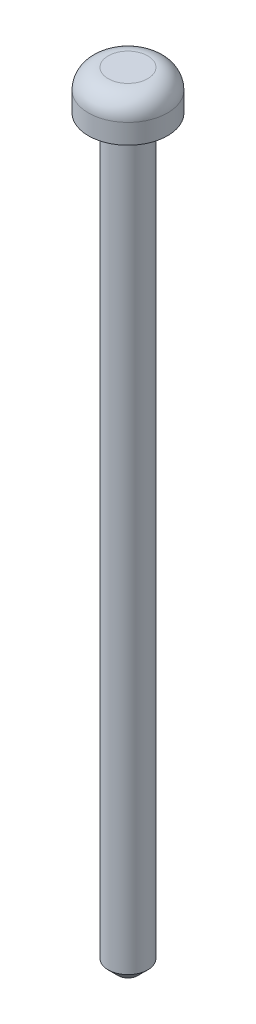
ISO-10303-21;
HEADER;
FILE_DESCRIPTION(('STEP AP214'),'2;1');
FILE_NAME('part.step','',(''),(''),'','','');
FILE_SCHEMA(('AUTOMOTIVE_DESIGN { 1 0 10303 214 1 1 1 1 }'));
ENDSEC;
DATA;
#1=APPLICATION_CONTEXT('core data for automotive mechanical design processes');
#2=APPLICATION_PROTOCOL_DEFINITION('international standard','automotive_design',2000,#1);
#3=PRODUCT_CONTEXT('',#1,'mechanical');
#4=PRODUCT('Part','Part','',(#3));
#5=PRODUCT_RELATED_PRODUCT_CATEGORY('part','',(#4));
#6=PRODUCT_DEFINITION_FORMATION('','',#4);
#7=PRODUCT_DEFINITION_CONTEXT('part definition',#1,'design');
#8=PRODUCT_DEFINITION('design','',#6,#7);
#9=PRODUCT_DEFINITION_SHAPE('','',#8);
#10=(LENGTH_UNIT() NAMED_UNIT(*) SI_UNIT(.MILLI.,.METRE.));
#11=(NAMED_UNIT(*) PLANE_ANGLE_UNIT() SI_UNIT($,.RADIAN.));
#12=(NAMED_UNIT(*) SI_UNIT($,.STERADIAN.) SOLID_ANGLE_UNIT());
#13=UNCERTAINTY_MEASURE_WITH_UNIT(LENGTH_MEASURE(1.E-05),#10,'distance_accuracy_value','');
#14=(GEOMETRIC_REPRESENTATION_CONTEXT(3) GLOBAL_UNCERTAINTY_ASSIGNED_CONTEXT((#13)) GLOBAL_UNIT_ASSIGNED_CONTEXT((#10,
#11,#12)) REPRESENTATION_CONTEXT('',''));
#15=CARTESIAN_POINT('',(0.,0.,0.));
#16=DIRECTION('',(0.,0.,1.));
#17=DIRECTION('',(1.,0.,0.));
#18=AXIS2_PLACEMENT_3D('',#15,#16,#17);
#19=CARTESIAN_POINT('',(0.,76.2,0.));
#20=DIRECTION('',(0.,-1.,0.));
#21=DIRECTION('',(0.,0.,-1.));
#22=AXIS2_PLACEMENT_3D('',#19,#20,#21);
#23=CYLINDRICAL_SURFACE('',#22,2.032);
#24=CARTESIAN_POINT('',(0.,1.01600000000006,0.));
#25=DIRECTION('',(0.,1.,0.));
#26=DIRECTION('',(0.,0.,1.));
#27=AXIS2_PLACEMENT_3D('',#24,#25,#26);
#28=CIRCLE('',#27,2.032);
#29=CARTESIAN_POINT('',(0.,1.01600000000004,-2.032));
#30=VERTEX_POINT('',#29);
#31=EDGE_CURVE('E52',#30,#30,#28,.T.);
#32=CARTESIAN_POINT('',(0.,76.2,0.));
#33=DIRECTION('',(0.,1.,0.));
#34=DIRECTION('',(0.,0.,1.));
#35=AXIS2_PLACEMENT_3D('',#32,#33,#34);
#36=CIRCLE('',#35,2.032);
#37=CARTESIAN_POINT('',(0.,76.2,-2.032));
#38=VERTEX_POINT('',#37);
#39=EDGE_CURVE('E70',#38,#38,#36,.T.);
#40=CARTESIAN_POINT('',(0.,1.01600000000004,-2.032));
#41=CARTESIAN_POINT('',(0.,1.79916666666671,-2.032));
#42=CARTESIAN_POINT('',(0.,2.58233333333338,-2.032));
#43=CARTESIAN_POINT('',(0.,4.14866666666671,-2.032));
#44=CARTESIAN_POINT('',(0.,4.93183333333338,-2.032));
#45=CARTESIAN_POINT('',(0.,6.49816666666671,-2.032));
#46=CARTESIAN_POINT('',(0.,7.28133333333338,-2.032));
#47=CARTESIAN_POINT('',(0.,8.84766666666671,-2.032));
#48=CARTESIAN_POINT('',(0.,9.63083333333337,-2.032));
#49=CARTESIAN_POINT('',(0.,11.1971666666667,-2.032));
#50=CARTESIAN_POINT('',(0.,11.9803333333334,-2.032));
#51=CARTESIAN_POINT('',(0.,13.5466666666667,-2.032));
#52=CARTESIAN_POINT('',(0.,14.3298333333334,-2.032));
#53=CARTESIAN_POINT('',(0.,15.8961666666667,-2.032));
#54=CARTESIAN_POINT('',(0.,16.6793333333334,-2.032));
#55=CARTESIAN_POINT('',(0.,18.2456666666667,-2.032));
#56=CARTESIAN_POINT('',(0.,19.0288333333334,-2.032));
#57=CARTESIAN_POINT('',(0.,20.5951666666667,-2.032));
#58=CARTESIAN_POINT('',(0.,21.3783333333334,-2.032));
#59=CARTESIAN_POINT('',(0.,22.9446666666667,-2.032));
#60=CARTESIAN_POINT('',(0.,23.7278333333334,-2.032));
#61=CARTESIAN_POINT('',(0.,25.2941666666667,-2.032));
#62=CARTESIAN_POINT('',(0.,26.0773333333334,-2.032));
#63=CARTESIAN_POINT('',(0.,27.6436666666667,-2.032));
#64=CARTESIAN_POINT('',(0.,28.4268333333334,-2.032));
#65=CARTESIAN_POINT('',(0.,29.9931666666667,-2.032));
#66=CARTESIAN_POINT('',(0.,30.7763333333334,-2.032));
#67=CARTESIAN_POINT('',(0.,32.3426666666667,-2.032));
#68=CARTESIAN_POINT('',(0.,33.1258333333334,-2.032));
#69=CARTESIAN_POINT('',(0.,34.6921666666667,-2.032));
#70=CARTESIAN_POINT('',(0.,35.4753333333334,-2.032));
#71=CARTESIAN_POINT('',(0.,37.0416666666667,-2.032));
#72=CARTESIAN_POINT('',(0.,37.8248333333334,-2.032));
#73=CARTESIAN_POINT('',(0.,39.3911666666667,-2.032));
#74=CARTESIAN_POINT('',(0.,40.1743333333334,-2.032));
#75=CARTESIAN_POINT('',(0.,41.7406666666667,-2.032));
#76=CARTESIAN_POINT('',(0.,42.5238333333334,-2.032));
#77=CARTESIAN_POINT('',(0.,44.0901666666667,-2.032));
#78=CARTESIAN_POINT('',(0.,44.8733333333333,-2.032));
#79=CARTESIAN_POINT('',(0.,46.4396666666667,-2.032));
#80=CARTESIAN_POINT('',(0.,47.2228333333334,-2.032));
#81=CARTESIAN_POINT('',(0.,48.7891666666667,-2.032));
#82=CARTESIAN_POINT('',(0.,49.5723333333333,-2.032));
#83=CARTESIAN_POINT('',(0.,51.1386666666667,-2.032));
#84=CARTESIAN_POINT('',(0.,51.9218333333333,-2.032));
#85=CARTESIAN_POINT('',(0.,53.4881666666667,-2.032));
#86=CARTESIAN_POINT('',(0.,54.2713333333334,-2.032));
#87=CARTESIAN_POINT('',(0.,55.8376666666667,-2.032));
#88=CARTESIAN_POINT('',(0.,56.6208333333334,-2.032));
#89=CARTESIAN_POINT('',(0.,58.1871666666667,-2.032));
#90=CARTESIAN_POINT('',(0.,58.9703333333333,-2.032));
#91=CARTESIAN_POINT('',(0.,60.5366666666667,-2.032));
#92=CARTESIAN_POINT('',(0.,61.3198333333333,-2.032));
#93=CARTESIAN_POINT('',(0.,62.8861666666667,-2.032));
#94=CARTESIAN_POINT('',(0.,63.6693333333333,-2.032));
#95=CARTESIAN_POINT('',(0.,65.2356666666667,-2.032));
#96=CARTESIAN_POINT('',(0.,66.0188333333333,-2.032));
#97=CARTESIAN_POINT('',(0.,67.5851666666667,-2.032));
#98=CARTESIAN_POINT('',(0.,68.3683333333333,-2.032));
#99=CARTESIAN_POINT('',(0.,69.9346666666667,-2.032));
#100=CARTESIAN_POINT('',(0.,70.7178333333333,-2.032));
#101=CARTESIAN_POINT('',(0.,72.2841666666667,-2.032));
#102=CARTESIAN_POINT('',(0.,73.0673333333333,-2.032));
#103=CARTESIAN_POINT('',(0.,74.6336666666667,-2.032));
#104=CARTESIAN_POINT('',(0.,75.4168333333333,-2.032));
#105=CARTESIAN_POINT('',(0.,76.2,-2.032));
#106=B_SPLINE_CURVE_WITH_KNOTS('',3,(#40,#41,#42,#43,#44,#45,#46,#47,#48,#49,#50,#51,#52,#53,
#54,#55,#56,#57,#58,#59,#60,#61,#62,#63,#64,#65,#66,#67,#68,#69,#70,#71,#72,#73,#74,#75,#76,#77,
#78,#79,#80,#81,#82,#83,#84,#85,#86,#87,#88,#89,#90,#91,#92,#93,#94,#95,#96,#97,#98,#99,#100,
#101,#102,#103,#104,#105),.UNSPECIFIED.,.F.,.F.,(4,2,2,2,2,2,2,2,2,2,2,2,2,2,2,2,2,2,2,2,2,2,2,
2,2,2,2,2,2,2,2,2,4),(0.,2.3495,4.69899999999999,7.0485,9.39799999999999,11.7475,14.097,16.4465,
18.796,21.1455,23.495,25.8445,28.194,30.5435,32.893,35.2425,37.592,39.9415,42.291,44.6405,46.99,
49.3395,51.689,54.0385,56.388,58.7375,61.087,63.4365,65.786,68.1355,70.485,72.8344999999999,
75.184),.UNSPECIFIED.);
#107=EDGE_CURVE('BSEAM42',#30,#38,#106,.T.);
#108=ORIENTED_EDGE('',*,*,#31,.T.);
#109=ORIENTED_EDGE('',*,*,#39,.F.);
#110=ORIENTED_EDGE('',*,*,#107,.T.);
#111=ORIENTED_EDGE('',*,*,#107,.F.);
#112=EDGE_LOOP('',(#108,#110,#109,#111));
#113=FACE_BOUND('',#112,.T.);
#114=ADVANCED_FACE('F42',(#113),#23,.T.);
#115=CARTESIAN_POINT('',(0.,0.,0.));
#116=DIRECTION('',(0.,1.,0.));
#117=DIRECTION('',(0.,0.,1.));
#118=AXIS2_PLACEMENT_3D('',#115,#116,#117);
#119=PLANE('',#118);
#120=CARTESIAN_POINT('',(0.,0.,0.));
#121=DIRECTION('',(0.,1.,0.));
#122=DIRECTION('',(0.,0.,1.));
#123=AXIS2_PLACEMENT_3D('',#120,#121,#122);
#124=CIRCLE('',#123,1.01599999999993);
#125=CARTESIAN_POINT('',(0.,0.,1.01599999999993));
#126=VERTEX_POINT('',#125);
#127=EDGE_CURVE('E10',#126,#126,#124,.F.);
#128=ORIENTED_EDGE('',*,*,#127,.T.);
#129=EDGE_LOOP('',(#128));
#130=FACE_BOUND('',#129,.T.);
#131=ADVANCED_FACE('F96',(#130),#119,.F.);
#132=CARTESIAN_POINT('',(0.,80.264,0.));
#133=DIRECTION('',(0.,-1.,0.));
#134=DIRECTION('',(0.,0.,-1.));
#135=AXIS2_PLACEMENT_3D('',#132,#133,#134);
#136=CYLINDRICAL_SURFACE('',#135,4.064);
#137=CARTESIAN_POINT('',(0.,78.232,0.));
#138=DIRECTION('',(0.,1.,0.));
#139=DIRECTION('',(0.,0.,1.));
#140=AXIS2_PLACEMENT_3D('',#137,#138,#139);
#141=CIRCLE('',#140,4.064);
#142=CARTESIAN_POINT('',(0.,78.232,4.064));
#143=VERTEX_POINT('',#142);
#144=EDGE_CURVE('E59',#143,#143,#141,.F.);
#145=ORIENTED_EDGE('',*,*,#144,.T.);
#146=EDGE_LOOP('',(#145));
#147=FACE_BOUND('',#146,.T.);
#148=CARTESIAN_POINT('',(0.,76.2,0.));
#149=DIRECTION('',(0.,1.,0.));
#150=DIRECTION('',(0.,0.,1.));
#151=AXIS2_PLACEMENT_3D('',#148,#149,#150);
#152=CIRCLE('',#151,4.064);
#153=CARTESIAN_POINT('',(0.,76.2,4.064));
#154=VERTEX_POINT('',#153);
#155=EDGE_CURVE('E71',#154,#154,#152,.T.);
#156=ORIENTED_EDGE('',*,*,#155,.T.);
#157=EDGE_LOOP('',(#156));
#158=FACE_BOUND('',#157,.T.);
#159=ADVANCED_FACE('F80',(#147,#158),#136,.T.);
#160=CARTESIAN_POINT('',(0.,80.264,0.));
#161=DIRECTION('',(0.,1.,0.));
#162=DIRECTION('',(0.,0.,1.));
#163=AXIS2_PLACEMENT_3D('',#160,#161,#162);
#164=PLANE('',#163);
#165=CARTESIAN_POINT('',(0.,80.264,0.));
#166=DIRECTION('',(0.,1.,0.));
#167=DIRECTION('',(0.,0.,1.));
#168=AXIS2_PLACEMENT_3D('',#165,#166,#167);
#169=CIRCLE('',#168,2.032);
#170=CARTESIAN_POINT('',(0.,80.264,2.032));
#171=VERTEX_POINT('',#170);
#172=EDGE_CURVE('E65',#171,#171,#169,.T.);
#173=ORIENTED_EDGE('',*,*,#172,.T.);
#174=EDGE_LOOP('',(#173));
#175=FACE_BOUND('',#174,.T.);
#176=ADVANCED_FACE('F82',(#175),#164,.T.);
#177=CARTESIAN_POINT('',(0.,76.2,0.));
#178=DIRECTION('',(0.,1.,0.));
#179=DIRECTION('',(0.,0.,1.));
#180=AXIS2_PLACEMENT_3D('',#177,#178,#179);
#181=PLANE('',#180);
#182=ORIENTED_EDGE('',*,*,#39,.T.);
#183=EDGE_LOOP('',(#182));
#184=FACE_BOUND('',#183,.T.);
#185=ORIENTED_EDGE('',*,*,#155,.F.);
#186=EDGE_LOOP('',(#185));
#187=FACE_BOUND('',#186,.T.);
#188=ADVANCED_FACE('F78',(#184,#187),#181,.F.);
#189=CARTESIAN_POINT('',(0.,78.232,0.));
#190=DIRECTION('',(0.,1.,0.));
#191=DIRECTION('',(0.,0.,1.));
#192=AXIS2_PLACEMENT_3D('',#189,#190,#191);
#193=DEGENERATE_TOROIDAL_SURFACE('',#192,2.032,2.032,.T.);
#194=ORIENTED_EDGE('',*,*,#144,.F.);
#195=EDGE_LOOP('',(#194));
#196=FACE_BOUND('',#195,.T.);
#197=ORIENTED_EDGE('',*,*,#172,.F.);
#198=EDGE_LOOP('',(#197));
#199=FACE_BOUND('',#198,.T.);
#200=ADVANCED_FACE('F84',(#196,#199),#193,.T.);
#201=CARTESIAN_POINT('',(0.,1.01600000000006,0.));
#202=DIRECTION('',(0.,1.,0.));
#203=DIRECTION('',(0.,0.,1.));
#204=AXIS2_PLACEMENT_3D('',#201,#202,#203);
#205=CONICAL_SURFACE('',#204,2.032,0.785398163397456);
#206=ORIENTED_EDGE('',*,*,#127,.F.);
#207=EDGE_LOOP('',(#206));
#208=FACE_BOUND('',#207,.T.);
#209=ORIENTED_EDGE('',*,*,#31,.F.);
#210=EDGE_LOOP('',(#209));
#211=FACE_BOUND('',#210,.T.);
#212=ADVANCED_FACE('F50',(#208,#211),#205,.T.);
#213=CLOSED_SHELL('',(#114,#131,#159,#176,#188,#200,#212));
#214=MANIFOLD_SOLID_BREP('B2',#213);
#215=ADVANCED_BREP_SHAPE_REPRESENTATION('',(#18,#214),#14);
#216=SHAPE_DEFINITION_REPRESENTATION(#9,#215);
ENDSEC;
END-ISO-10303-21;
